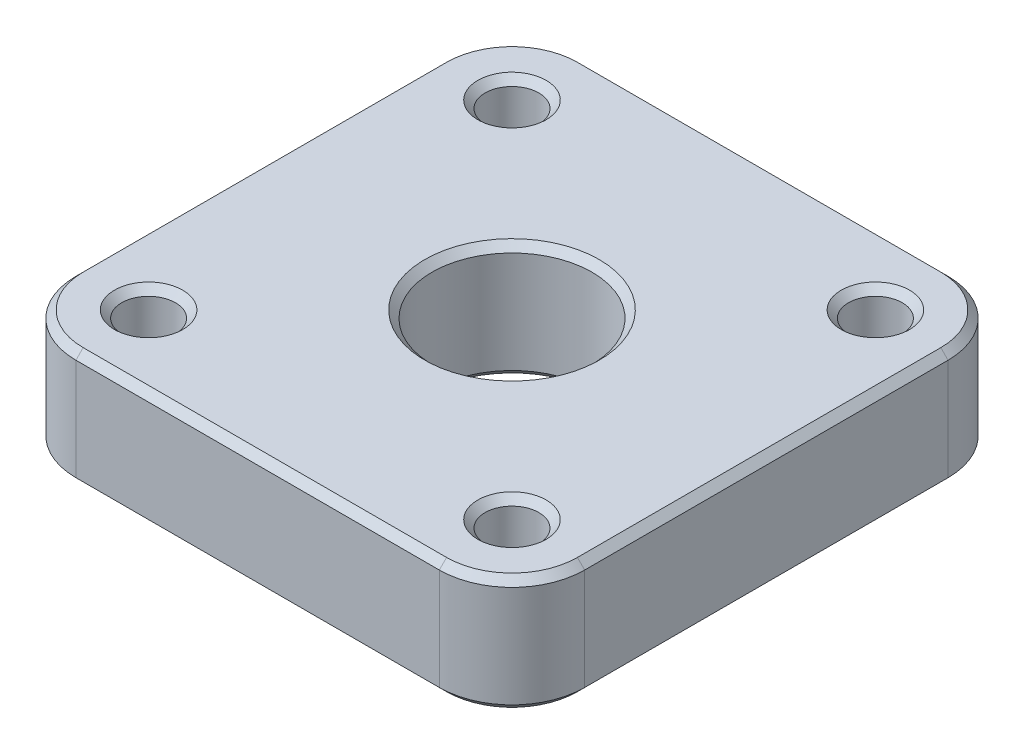
ISO-10303-21;
HEADER;
FILE_DESCRIPTION(('STEP AP214'),'2;1');
FILE_NAME('part.step','',(''),(''),'','','');
FILE_SCHEMA(('AUTOMOTIVE_DESIGN { 1 0 10303 214 1 1 1 1 }'));
ENDSEC;
DATA;
#1=APPLICATION_CONTEXT('core data for automotive mechanical design processes');
#2=APPLICATION_PROTOCOL_DEFINITION('international standard','automotive_design',2000,#1);
#3=PRODUCT_CONTEXT('',#1,'mechanical');
#4=PRODUCT('Part','Part','',(#3));
#5=PRODUCT_RELATED_PRODUCT_CATEGORY('part','',(#4));
#6=PRODUCT_DEFINITION_FORMATION('','',#4);
#7=PRODUCT_DEFINITION_CONTEXT('part definition',#1,'design');
#8=PRODUCT_DEFINITION('design','',#6,#7);
#9=PRODUCT_DEFINITION_SHAPE('','',#8);
#10=(LENGTH_UNIT() NAMED_UNIT(*) SI_UNIT(.MILLI.,.METRE.));
#11=(NAMED_UNIT(*) PLANE_ANGLE_UNIT() SI_UNIT($,.RADIAN.));
#12=(NAMED_UNIT(*) SI_UNIT($,.STERADIAN.) SOLID_ANGLE_UNIT());
#13=UNCERTAINTY_MEASURE_WITH_UNIT(LENGTH_MEASURE(1.E-05),#10,'distance_accuracy_value','');
#14=(GEOMETRIC_REPRESENTATION_CONTEXT(3) GLOBAL_UNCERTAINTY_ASSIGNED_CONTEXT((#13)) GLOBAL_UNIT_ASSIGNED_CONTEXT((#10,
#11,#12)) REPRESENTATION_CONTEXT('',''));
#15=CARTESIAN_POINT('',(0.,0.,0.));
#16=DIRECTION('',(0.,0.,1.));
#17=DIRECTION('',(1.,0.,0.));
#18=AXIS2_PLACEMENT_3D('',#15,#16,#17);
#19=CARTESIAN_POINT('',(35.,16.,35.));
#20=DIRECTION('',(-1.,0.,0.));
#21=DIRECTION('',(0.,0.,1.));
#22=AXIS2_PLACEMENT_3D('',#19,#20,#21);
#23=PLANE('',#22);
#24=DIRECTION('',(0.,-1.,0.));
#25=VECTOR('',#24,1.);
#26=CARTESIAN_POINT('',(35.,16.,25.));
#27=LINE('',#26,#25);
#28=CARTESIAN_POINT('',(35.,15.,25.));
#29=VERTEX_POINT('',#28);
#30=CARTESIAN_POINT('',(35.,1.,25.));
#31=VERTEX_POINT('',#30);
#32=EDGE_CURVE('E390',#29,#31,#27,.T.);
#33=ORIENTED_EDGE('',*,*,#32,.T.);
#34=DIRECTION('',(0.,0.,-1.));
#35=VECTOR('',#34,1.);
#36=CARTESIAN_POINT('',(35.,1.,-25.));
#37=LINE('',#36,#35);
#38=CARTESIAN_POINT('',(35.,1.,-25.));
#39=VERTEX_POINT('',#38);
#40=EDGE_CURVE('E200',#31,#39,#37,.T.);
#41=ORIENTED_EDGE('',*,*,#40,.T.);
#42=DIRECTION('',(0.,-1.,0.));
#43=VECTOR('',#42,1.);
#44=CARTESIAN_POINT('',(35.,16.,-25.));
#45=LINE('',#44,#43);
#46=CARTESIAN_POINT('',(35.,15.,-25.));
#47=VERTEX_POINT('',#46);
#48=EDGE_CURVE('E417',#39,#47,#45,.F.);
#49=ORIENTED_EDGE('',*,*,#48,.T.);
#50=DIRECTION('',(0.,0.,1.));
#51=VECTOR('',#50,1.);
#52=CARTESIAN_POINT('',(35.,15.,35.));
#53=LINE('',#52,#51);
#54=EDGE_CURVE('E197',#47,#29,#53,.T.);
#55=ORIENTED_EDGE('',*,*,#54,.T.);
#56=EDGE_LOOP('',(#33,#41,#49,#55));
#57=FACE_BOUND('',#56,.T.);
#58=ADVANCED_FACE('F41',(#57),#23,.F.);
#59=CARTESIAN_POINT('',(-35.,16.,-35.));
#60=DIRECTION('',(0.,0.,1.));
#61=DIRECTION('',(1.,0.,0.));
#62=AXIS2_PLACEMENT_3D('',#59,#60,#61);
#63=PLANE('',#62);
#64=DIRECTION('',(0.,-1.,0.));
#65=VECTOR('',#64,1.);
#66=CARTESIAN_POINT('',(25.,16.,-35.));
#67=LINE('',#66,#65);
#68=CARTESIAN_POINT('',(25.,15.,-35.));
#69=VERTEX_POINT('',#68);
#70=CARTESIAN_POINT('',(25.,1.,-35.));
#71=VERTEX_POINT('',#70);
#72=EDGE_CURVE('E409',#69,#71,#67,.T.);
#73=ORIENTED_EDGE('',*,*,#72,.T.);
#74=DIRECTION('',(-1.,0.,0.));
#75=VECTOR('',#74,1.);
#76=CARTESIAN_POINT('',(-25.,1.,-35.));
#77=LINE('',#76,#75);
#78=CARTESIAN_POINT('',(-25.,1.,-35.));
#79=VERTEX_POINT('',#78);
#80=EDGE_CURVE('E212',#71,#79,#77,.T.);
#81=ORIENTED_EDGE('',*,*,#80,.T.);
#82=DIRECTION('',(0.,-1.,0.));
#83=VECTOR('',#82,1.);
#84=CARTESIAN_POINT('',(-25.,16.,-35.));
#85=LINE('',#84,#83);
#86=CARTESIAN_POINT('',(-25.,15.,-35.));
#87=VERTEX_POINT('',#86);
#88=EDGE_CURVE('E413',#79,#87,#85,.F.);
#89=ORIENTED_EDGE('',*,*,#88,.T.);
#90=DIRECTION('',(1.,0.,0.));
#91=VECTOR('',#90,1.);
#92=CARTESIAN_POINT('',(-35.,15.,-35.));
#93=LINE('',#92,#91);
#94=EDGE_CURVE('E209',#87,#69,#93,.T.);
#95=ORIENTED_EDGE('',*,*,#94,.T.);
#96=EDGE_LOOP('',(#73,#81,#89,#95));
#97=FACE_BOUND('',#96,.T.);
#98=ADVANCED_FACE('F509',(#97),#63,.F.);
#99=CARTESIAN_POINT('',(-35.,16.,35.));
#100=DIRECTION('',(1.,0.,0.));
#101=DIRECTION('',(0.,0.,-1.));
#102=AXIS2_PLACEMENT_3D('',#99,#100,#101);
#103=PLANE('',#102);
#104=DIRECTION('',(0.,-1.,0.));
#105=VECTOR('',#104,1.);
#106=CARTESIAN_POINT('',(-35.,16.,-25.));
#107=LINE('',#106,#105);
#108=CARTESIAN_POINT('',(-35.,15.,-25.));
#109=VERTEX_POINT('',#108);
#110=CARTESIAN_POINT('',(-35.,1.,-25.));
#111=VERTEX_POINT('',#110);
#112=EDGE_CURVE('E399',#109,#111,#107,.T.);
#113=ORIENTED_EDGE('',*,*,#112,.T.);
#114=DIRECTION('',(0.,0.,1.));
#115=VECTOR('',#114,1.);
#116=CARTESIAN_POINT('',(-35.,1.,25.));
#117=LINE('',#116,#115);
#118=CARTESIAN_POINT('',(-35.,1.,25.));
#119=VERTEX_POINT('',#118);
#120=EDGE_CURVE('E225',#111,#119,#117,.T.);
#121=ORIENTED_EDGE('',*,*,#120,.T.);
#122=DIRECTION('',(0.,-1.,0.));
#123=VECTOR('',#122,1.);
#124=CARTESIAN_POINT('',(-35.,16.,25.));
#125=LINE('',#124,#123);
#126=CARTESIAN_POINT('',(-35.,15.,25.));
#127=VERTEX_POINT('',#126);
#128=EDGE_CURVE('E405',#119,#127,#125,.F.);
#129=ORIENTED_EDGE('',*,*,#128,.T.);
#130=DIRECTION('',(0.,0.,-1.));
#131=VECTOR('',#130,1.);
#132=CARTESIAN_POINT('',(-35.,15.,35.));
#133=LINE('',#132,#131);
#134=EDGE_CURVE('E222',#127,#109,#133,.T.);
#135=ORIENTED_EDGE('',*,*,#134,.T.);
#136=EDGE_LOOP('',(#113,#121,#129,#135));
#137=FACE_BOUND('',#136,.T.);
#138=ADVANCED_FACE('F493',(#137),#103,.F.);
#139=CARTESIAN_POINT('',(-35.,16.,35.));
#140=DIRECTION('',(0.,0.,-1.));
#141=DIRECTION('',(-1.,0.,0.));
#142=AXIS2_PLACEMENT_3D('',#139,#140,#141);
#143=PLANE('',#142);
#144=DIRECTION('',(0.,-1.,0.));
#145=VECTOR('',#144,1.);
#146=CARTESIAN_POINT('',(-25.,16.,35.));
#147=LINE('',#146,#145);
#148=CARTESIAN_POINT('',(-25.,15.,35.));
#149=VERTEX_POINT('',#148);
#150=CARTESIAN_POINT('',(-25.,1.,35.));
#151=VERTEX_POINT('',#150);
#152=EDGE_CURVE('E396',#149,#151,#147,.T.);
#153=ORIENTED_EDGE('',*,*,#152,.T.);
#154=DIRECTION('',(1.,0.,0.));
#155=VECTOR('',#154,1.);
#156=CARTESIAN_POINT('',(25.,1.,35.));
#157=LINE('',#156,#155);
#158=CARTESIAN_POINT('',(25.,1.,35.));
#159=VERTEX_POINT('',#158);
#160=EDGE_CURVE('E237',#151,#159,#157,.T.);
#161=ORIENTED_EDGE('',*,*,#160,.T.);
#162=DIRECTION('',(0.,-1.,0.));
#163=VECTOR('',#162,1.);
#164=CARTESIAN_POINT('',(25.,16.,35.));
#165=LINE('',#164,#163);
#166=CARTESIAN_POINT('',(25.,15.,35.));
#167=VERTEX_POINT('',#166);
#168=EDGE_CURVE('E343',#159,#167,#165,.F.);
#169=ORIENTED_EDGE('',*,*,#168,.T.);
#170=DIRECTION('',(-1.,0.,0.));
#171=VECTOR('',#170,1.);
#172=CARTESIAN_POINT('',(-35.,15.,35.));
#173=LINE('',#172,#171);
#174=EDGE_CURVE('E234',#167,#149,#173,.T.);
#175=ORIENTED_EDGE('',*,*,#174,.T.);
#176=EDGE_LOOP('',(#153,#161,#169,#175));
#177=FACE_BOUND('',#176,.T.);
#178=ADVANCED_FACE('F393',(#177),#143,.F.);
#179=CARTESIAN_POINT('',(0.,16.,0.));
#180=DIRECTION('',(0.,-1.,0.));
#181=DIRECTION('',(0.,0.,-1.));
#182=AXIS2_PLACEMENT_3D('',#179,#180,#181);
#183=PLANE('',#182);
#184=DIRECTION('',(-1.,0.,0.));
#185=VECTOR('',#184,1.);
#186=CARTESIAN_POINT('',(0.,16.,-34.));
#187=LINE('',#186,#185);
#188=CARTESIAN_POINT('',(25.,16.,-34.));
#189=VERTEX_POINT('',#188);
#190=CARTESIAN_POINT('',(-25.,16.,-34.));
#191=VERTEX_POINT('',#190);
#192=EDGE_CURVE('E52',#189,#191,#187,.T.);
#193=ORIENTED_EDGE('',*,*,#192,.T.);
#194=CARTESIAN_POINT('',(-25.,16.,-25.));
#195=DIRECTION('',(0.,-1.,0.));
#196=DIRECTION('',(0.,0.,-1.));
#197=AXIS2_PLACEMENT_3D('',#194,#195,#196);
#198=CIRCLE('',#197,9.);
#199=CARTESIAN_POINT('',(-34.,16.,-25.));
#200=VERTEX_POINT('',#199);
#201=EDGE_CURVE('E11',#191,#200,#198,.F.);
#202=ORIENTED_EDGE('',*,*,#201,.T.);
#203=DIRECTION('',(0.,0.,1.));
#204=VECTOR('',#203,1.);
#205=CARTESIAN_POINT('',(-34.,16.,0.));
#206=LINE('',#205,#204);
#207=CARTESIAN_POINT('',(-34.,16.,25.));
#208=VERTEX_POINT('',#207);
#209=EDGE_CURVE('E300',#200,#208,#206,.T.);
#210=ORIENTED_EDGE('',*,*,#209,.T.);
#211=CARTESIAN_POINT('',(-25.,16.,25.));
#212=DIRECTION('',(0.,-1.,0.));
#213=DIRECTION('',(0.,0.,-1.));
#214=AXIS2_PLACEMENT_3D('',#211,#212,#213);
#215=CIRCLE('',#214,9.);
#216=CARTESIAN_POINT('',(-25.,16.,34.));
#217=VERTEX_POINT('',#216);
#218=EDGE_CURVE('E303',#208,#217,#215,.F.);
#219=ORIENTED_EDGE('',*,*,#218,.T.);
#220=DIRECTION('',(1.,0.,0.));
#221=VECTOR('',#220,1.);
#222=CARTESIAN_POINT('',(0.,16.,34.));
#223=LINE('',#222,#221);
#224=CARTESIAN_POINT('',(25.,16.,34.));
#225=VERTEX_POINT('',#224);
#226=EDGE_CURVE('E306',#217,#225,#223,.T.);
#227=ORIENTED_EDGE('',*,*,#226,.T.);
#228=CARTESIAN_POINT('',(25.,16.,25.));
#229=DIRECTION('',(0.,-1.,0.));
#230=DIRECTION('',(0.,0.,-1.));
#231=AXIS2_PLACEMENT_3D('',#228,#229,#230);
#232=CIRCLE('',#231,9.);
#233=CARTESIAN_POINT('',(34.,16.,25.));
#234=VERTEX_POINT('',#233);
#235=EDGE_CURVE('E309',#225,#234,#232,.F.);
#236=ORIENTED_EDGE('',*,*,#235,.T.);
#237=DIRECTION('',(0.,0.,-1.));
#238=VECTOR('',#237,1.);
#239=CARTESIAN_POINT('',(34.,16.,0.));
#240=LINE('',#239,#238);
#241=CARTESIAN_POINT('',(34.,16.,-25.));
#242=VERTEX_POINT('',#241);
#243=EDGE_CURVE('E312',#234,#242,#240,.T.);
#244=ORIENTED_EDGE('',*,*,#243,.T.);
#245=CARTESIAN_POINT('',(25.,16.,-25.));
#246=DIRECTION('',(0.,-1.,0.));
#247=DIRECTION('',(0.,0.,-1.));
#248=AXIS2_PLACEMENT_3D('',#245,#246,#247);
#249=CIRCLE('',#248,9.);
#250=EDGE_CURVE('E63',#242,#189,#249,.F.);
#251=ORIENTED_EDGE('',*,*,#250,.T.);
#252=EDGE_LOOP('',(#193,#202,#210,#219,#227,#236,#244,#251));
#253=FACE_BOUND('',#252,.T.);
#254=CARTESIAN_POINT('',(0.,16.,0.));
#255=DIRECTION('',(0.,-1.,0.));
#256=DIRECTION('',(0.,0.,-1.));
#257=AXIS2_PLACEMENT_3D('',#254,#255,#256);
#258=CIRCLE('',#257,12.);
#259=CARTESIAN_POINT('',(0.,16.,-12.));
#260=VERTEX_POINT('',#259);
#261=EDGE_CURVE('E296',#260,#260,#258,.T.);
#262=ORIENTED_EDGE('',*,*,#261,.T.);
#263=EDGE_LOOP('',(#262));
#264=FACE_BOUND('',#263,.T.);
#265=CARTESIAN_POINT('',(-25.,16.,-25.));
#266=DIRECTION('',(0.,-1.,0.));
#267=DIRECTION('',(0.,0.,-1.));
#268=AXIS2_PLACEMENT_3D('',#265,#266,#267);
#269=CIRCLE('',#268,4.70000000000001);
#270=CARTESIAN_POINT('',(-25.,16.,-29.7));
#271=VERTEX_POINT('',#270);
#272=EDGE_CURVE('E292',#271,#271,#269,.T.);
#273=ORIENTED_EDGE('',*,*,#272,.T.);
#274=EDGE_LOOP('',(#273));
#275=FACE_BOUND('',#274,.T.);
#276=CARTESIAN_POINT('',(25.,16.,-25.));
#277=DIRECTION('',(0.,-1.,0.));
#278=DIRECTION('',(0.,0.,-1.));
#279=AXIS2_PLACEMENT_3D('',#276,#277,#278);
#280=CIRCLE('',#279,4.70000000000002);
#281=CARTESIAN_POINT('',(25.,16.,-29.7));
#282=VERTEX_POINT('',#281);
#283=EDGE_CURVE('E288',#282,#282,#280,.T.);
#284=ORIENTED_EDGE('',*,*,#283,.T.);
#285=EDGE_LOOP('',(#284));
#286=FACE_BOUND('',#285,.T.);
#287=CARTESIAN_POINT('',(25.,16.,25.));
#288=DIRECTION('',(0.,-1.,0.));
#289=DIRECTION('',(0.,0.,-1.));
#290=AXIS2_PLACEMENT_3D('',#287,#288,#289);
#291=CIRCLE('',#290,4.70000000000002);
#292=CARTESIAN_POINT('',(25.,16.,20.3));
#293=VERTEX_POINT('',#292);
#294=EDGE_CURVE('E284',#293,#293,#291,.T.);
#295=ORIENTED_EDGE('',*,*,#294,.T.);
#296=EDGE_LOOP('',(#295));
#297=FACE_BOUND('',#296,.T.);
#298=CARTESIAN_POINT('',(-25.,16.,25.));
#299=DIRECTION('',(0.,-1.,0.));
#300=DIRECTION('',(0.,0.,-1.));
#301=AXIS2_PLACEMENT_3D('',#298,#299,#300);
#302=CIRCLE('',#301,4.70000000000002);
#303=CARTESIAN_POINT('',(-25.,16.,20.3));
#304=VERTEX_POINT('',#303);
#305=EDGE_CURVE('E280',#304,#304,#302,.T.);
#306=ORIENTED_EDGE('',*,*,#305,.T.);
#307=EDGE_LOOP('',(#306));
#308=FACE_BOUND('',#307,.T.);
#309=ADVANCED_FACE('F480',(#253,#264,#275,#286,#297,#308),#183,.F.);
#310=CARTESIAN_POINT('',(0.,0.,0.));
#311=DIRECTION('',(0.,-1.,0.));
#312=DIRECTION('',(0.,0.,-1.));
#313=AXIS2_PLACEMENT_3D('',#310,#311,#312);
#314=PLANE('',#313);
#315=DIRECTION('',(0.,0.,1.));
#316=VECTOR('',#315,1.);
#317=CARTESIAN_POINT('',(34.,0.,25.));
#318=LINE('',#317,#316);
#319=CARTESIAN_POINT('',(34.,0.,-25.));
#320=VERTEX_POINT('',#319);
#321=CARTESIAN_POINT('',(34.,0.,25.));
#322=VERTEX_POINT('',#321);
#323=EDGE_CURVE('E183',#320,#322,#318,.T.);
#324=ORIENTED_EDGE('',*,*,#323,.T.);
#325=CARTESIAN_POINT('',(25.,0.,25.));
#326=DIRECTION('',(0.,-1.,0.));
#327=DIRECTION('',(0.,0.,-1.));
#328=AXIS2_PLACEMENT_3D('',#325,#326,#327);
#329=CIRCLE('',#328,9.);
#330=CARTESIAN_POINT('',(25.,0.,34.));
#331=VERTEX_POINT('',#330);
#332=EDGE_CURVE('E161',#322,#331,#329,.T.);
#333=ORIENTED_EDGE('',*,*,#332,.T.);
#334=DIRECTION('',(-1.,0.,0.));
#335=VECTOR('',#334,1.);
#336=CARTESIAN_POINT('',(-25.,0.,34.));
#337=LINE('',#336,#335);
#338=CARTESIAN_POINT('',(-25.,0.,34.));
#339=VERTEX_POINT('',#338);
#340=EDGE_CURVE('E170',#331,#339,#337,.T.);
#341=ORIENTED_EDGE('',*,*,#340,.T.);
#342=CARTESIAN_POINT('',(-25.,0.,25.));
#343=DIRECTION('',(0.,-1.,0.));
#344=DIRECTION('',(0.,0.,-1.));
#345=AXIS2_PLACEMENT_3D('',#342,#343,#344);
#346=CIRCLE('',#345,9.);
#347=CARTESIAN_POINT('',(-34.,0.,25.));
#348=VERTEX_POINT('',#347);
#349=EDGE_CURVE('E177',#339,#348,#346,.T.);
#350=ORIENTED_EDGE('',*,*,#349,.T.);
#351=DIRECTION('',(0.,0.,-1.));
#352=VECTOR('',#351,1.);
#353=CARTESIAN_POINT('',(-34.,0.,-25.));
#354=LINE('',#353,#352);
#355=CARTESIAN_POINT('',(-34.,0.,-25.));
#356=VERTEX_POINT('',#355);
#357=EDGE_CURVE('E444',#348,#356,#354,.T.);
#358=ORIENTED_EDGE('',*,*,#357,.T.);
#359=CARTESIAN_POINT('',(-25.,0.,-25.));
#360=DIRECTION('',(0.,-1.,0.));
#361=DIRECTION('',(0.,0.,-1.));
#362=AXIS2_PLACEMENT_3D('',#359,#360,#361);
#363=CIRCLE('',#362,9.);
#364=CARTESIAN_POINT('',(-25.,0.,-34.));
#365=VERTEX_POINT('',#364);
#366=EDGE_CURVE('E447',#356,#365,#363,.T.);
#367=ORIENTED_EDGE('',*,*,#366,.T.);
#368=DIRECTION('',(1.,0.,0.));
#369=VECTOR('',#368,1.);
#370=CARTESIAN_POINT('',(25.,0.,-34.));
#371=LINE('',#370,#369);
#372=CARTESIAN_POINT('',(25.,0.,-34.));
#373=VERTEX_POINT('',#372);
#374=EDGE_CURVE('E450',#365,#373,#371,.T.);
#375=ORIENTED_EDGE('',*,*,#374,.T.);
#376=CARTESIAN_POINT('',(25.,0.,-25.));
#377=DIRECTION('',(0.,-1.,0.));
#378=DIRECTION('',(0.,0.,-1.));
#379=AXIS2_PLACEMENT_3D('',#376,#377,#378);
#380=CIRCLE('',#379,9.);
#381=EDGE_CURVE('E191',#373,#320,#380,.T.);
#382=ORIENTED_EDGE('',*,*,#381,.T.);
#383=EDGE_LOOP('',(#324,#333,#341,#350,#358,#367,#375,#382));
#384=FACE_BOUND('',#383,.T.);
#385=CARTESIAN_POINT('',(0.,0.,0.));
#386=DIRECTION('',(0.,-1.,0.));
#387=DIRECTION('',(0.,0.,-1.));
#388=AXIS2_PLACEMENT_3D('',#385,#386,#387);
#389=CIRCLE('',#388,12.);
#390=CARTESIAN_POINT('',(0.,0.,-12.));
#391=VERTEX_POINT('',#390);
#392=EDGE_CURVE('E178',#391,#391,#389,.F.);
#393=ORIENTED_EDGE('',*,*,#392,.T.);
#394=EDGE_LOOP('',(#393));
#395=FACE_BOUND('',#394,.T.);
#396=CARTESIAN_POINT('',(-25.,0.,-25.));
#397=DIRECTION('',(0.,-1.,0.));
#398=DIRECTION('',(0.,0.,-1.));
#399=AXIS2_PLACEMENT_3D('',#396,#397,#398);
#400=CIRCLE('',#399,4.7);
#401=CARTESIAN_POINT('',(-25.,0.,-29.7));
#402=VERTEX_POINT('',#401);
#403=EDGE_CURVE('E435',#402,#402,#400,.F.);
#404=ORIENTED_EDGE('',*,*,#403,.T.);
#405=EDGE_LOOP('',(#404));
#406=FACE_BOUND('',#405,.T.);
#407=CARTESIAN_POINT('',(25.,0.,-25.));
#408=DIRECTION('',(0.,-1.,0.));
#409=DIRECTION('',(0.,0.,-1.));
#410=AXIS2_PLACEMENT_3D('',#407,#408,#409);
#411=CIRCLE('',#410,4.7);
#412=CARTESIAN_POINT('',(25.,0.,-29.7));
#413=VERTEX_POINT('',#412);
#414=EDGE_CURVE('E431',#413,#413,#411,.F.);
#415=ORIENTED_EDGE('',*,*,#414,.T.);
#416=EDGE_LOOP('',(#415));
#417=FACE_BOUND('',#416,.T.);
#418=CARTESIAN_POINT('',(25.,0.,25.));
#419=DIRECTION('',(0.,-1.,0.));
#420=DIRECTION('',(0.,0.,-1.));
#421=AXIS2_PLACEMENT_3D('',#418,#419,#420);
#422=CIRCLE('',#421,4.7);
#423=CARTESIAN_POINT('',(25.,0.,20.3));
#424=VERTEX_POINT('',#423);
#425=EDGE_CURVE('E427',#424,#424,#422,.F.);
#426=ORIENTED_EDGE('',*,*,#425,.T.);
#427=EDGE_LOOP('',(#426));
#428=FACE_BOUND('',#427,.T.);
#429=CARTESIAN_POINT('',(-25.,0.,25.));
#430=DIRECTION('',(0.,-1.,0.));
#431=DIRECTION('',(0.,0.,-1.));
#432=AXIS2_PLACEMENT_3D('',#429,#430,#431);
#433=CIRCLE('',#432,4.7);
#434=CARTESIAN_POINT('',(-25.,0.,20.3));
#435=VERTEX_POINT('',#434);
#436=EDGE_CURVE('E423',#435,#435,#433,.F.);
#437=ORIENTED_EDGE('',*,*,#436,.T.);
#438=EDGE_LOOP('',(#437));
#439=FACE_BOUND('',#438,.T.);
#440=ADVANCED_FACE('F180',(#384,#395,#406,#417,#428,#439),#314,.T.);
#441=CARTESIAN_POINT('',(0.,0.,0.));
#442=DIRECTION('',(0.,1.,0.));
#443=DIRECTION('',(0.,0.,1.));
#444=AXIS2_PLACEMENT_3D('',#441,#442,#443);
#445=CYLINDRICAL_SURFACE('',#444,11.);
#446=CARTESIAN_POINT('',(0.,1.00000000000001,0.));
#447=DIRECTION('',(0.,-1.,0.));
#448=DIRECTION('',(0.,0.,-1.));
#449=AXIS2_PLACEMENT_3D('',#446,#447,#448);
#450=CIRCLE('',#449,11.);
#451=CARTESIAN_POINT('',(0.,1.00000000000001,-11.));
#452=VERTEX_POINT('',#451);
#453=EDGE_CURVE('E244',#452,#452,#450,.T.);
#454=ORIENTED_EDGE('',*,*,#453,.T.);
#455=EDGE_LOOP('',(#454));
#456=FACE_BOUND('',#455,.T.);
#457=CARTESIAN_POINT('',(0.,15.,0.));
#458=DIRECTION('',(0.,-1.,0.));
#459=DIRECTION('',(0.,0.,-1.));
#460=AXIS2_PLACEMENT_3D('',#457,#458,#459);
#461=CIRCLE('',#460,11.);
#462=CARTESIAN_POINT('',(0.,15.,-11.));
#463=VERTEX_POINT('',#462);
#464=EDGE_CURVE('E240',#463,#463,#461,.F.);
#465=ORIENTED_EDGE('',*,*,#464,.T.);
#466=EDGE_LOOP('',(#465));
#467=FACE_BOUND('',#466,.T.);
#468=ADVANCED_FACE('F701',(#456,#467),#445,.F.);
#469=CARTESIAN_POINT('',(-25.,0.,-25.));
#470=DIRECTION('',(0.,1.,0.));
#471=DIRECTION('',(0.,0.,1.));
#472=AXIS2_PLACEMENT_3D('',#469,#470,#471);
#473=CYLINDRICAL_SURFACE('',#472,3.7);
#474=CARTESIAN_POINT('',(-25.,0.999999999999994,-25.));
#475=DIRECTION('',(0.,-1.,0.));
#476=DIRECTION('',(0.,0.,-1.));
#477=AXIS2_PLACEMENT_3D('',#474,#475,#476);
#478=CIRCLE('',#477,3.7);
#479=CARTESIAN_POINT('',(-25.,0.999999999999994,-28.7));
#480=VERTEX_POINT('',#479);
#481=EDGE_CURVE('E252',#480,#480,#478,.T.);
#482=ORIENTED_EDGE('',*,*,#481,.T.);
#483=EDGE_LOOP('',(#482));
#484=FACE_BOUND('',#483,.T.);
#485=CARTESIAN_POINT('',(-25.,15.,-25.));
#486=DIRECTION('',(0.,-1.,0.));
#487=DIRECTION('',(0.,0.,-1.));
#488=AXIS2_PLACEMENT_3D('',#485,#486,#487);
#489=CIRCLE('',#488,3.7);
#490=CARTESIAN_POINT('',(-25.,15.,-28.7));
#491=VERTEX_POINT('',#490);
#492=EDGE_CURVE('E248',#491,#491,#489,.F.);
#493=ORIENTED_EDGE('',*,*,#492,.T.);
#494=EDGE_LOOP('',(#493));
#495=FACE_BOUND('',#494,.T.);
#496=ADVANCED_FACE('F696',(#484,#495),#473,.F.);
#497=CARTESIAN_POINT('',(25.,0.,-25.));
#498=DIRECTION('',(0.,1.,0.));
#499=DIRECTION('',(0.,0.,1.));
#500=AXIS2_PLACEMENT_3D('',#497,#498,#499);
#501=CYLINDRICAL_SURFACE('',#500,3.7);
#502=CARTESIAN_POINT('',(25.,0.999999999999994,-25.));
#503=DIRECTION('',(0.,-1.,0.));
#504=DIRECTION('',(0.,0.,-1.));
#505=AXIS2_PLACEMENT_3D('',#502,#503,#504);
#506=CIRCLE('',#505,3.7);
#507=CARTESIAN_POINT('',(25.,0.999999999999994,-28.7));
#508=VERTEX_POINT('',#507);
#509=EDGE_CURVE('E260',#508,#508,#506,.T.);
#510=ORIENTED_EDGE('',*,*,#509,.T.);
#511=EDGE_LOOP('',(#510));
#512=FACE_BOUND('',#511,.T.);
#513=CARTESIAN_POINT('',(25.,15.,-25.));
#514=DIRECTION('',(0.,-1.,0.));
#515=DIRECTION('',(0.,0.,-1.));
#516=AXIS2_PLACEMENT_3D('',#513,#514,#515);
#517=CIRCLE('',#516,3.7);
#518=CARTESIAN_POINT('',(25.,15.,-28.7));
#519=VERTEX_POINT('',#518);
#520=EDGE_CURVE('E256',#519,#519,#517,.F.);
#521=ORIENTED_EDGE('',*,*,#520,.T.);
#522=EDGE_LOOP('',(#521));
#523=FACE_BOUND('',#522,.T.);
#524=ADVANCED_FACE('F687',(#512,#523),#501,.F.);
#525=CARTESIAN_POINT('',(25.,0.,25.));
#526=DIRECTION('',(0.,1.,0.));
#527=DIRECTION('',(0.,0.,1.));
#528=AXIS2_PLACEMENT_3D('',#525,#526,#527);
#529=CYLINDRICAL_SURFACE('',#528,3.7);
#530=CARTESIAN_POINT('',(25.,0.999999999999994,25.));
#531=DIRECTION('',(0.,-1.,0.));
#532=DIRECTION('',(0.,0.,-1.));
#533=AXIS2_PLACEMENT_3D('',#530,#531,#532);
#534=CIRCLE('',#533,3.7);
#535=CARTESIAN_POINT('',(25.,0.999999999999994,21.3));
#536=VERTEX_POINT('',#535);
#537=EDGE_CURVE('E268',#536,#536,#534,.T.);
#538=ORIENTED_EDGE('',*,*,#537,.T.);
#539=EDGE_LOOP('',(#538));
#540=FACE_BOUND('',#539,.T.);
#541=CARTESIAN_POINT('',(25.,15.,25.));
#542=DIRECTION('',(0.,-1.,0.));
#543=DIRECTION('',(0.,0.,-1.));
#544=AXIS2_PLACEMENT_3D('',#541,#542,#543);
#545=CIRCLE('',#544,3.7);
#546=CARTESIAN_POINT('',(25.,15.,21.3));
#547=VERTEX_POINT('',#546);
#548=EDGE_CURVE('E264',#547,#547,#545,.F.);
#549=ORIENTED_EDGE('',*,*,#548,.T.);
#550=EDGE_LOOP('',(#549));
#551=FACE_BOUND('',#550,.T.);
#552=ADVANCED_FACE('F685',(#540,#551),#529,.F.);
#553=CARTESIAN_POINT('',(-25.,0.,25.));
#554=DIRECTION('',(0.,1.,0.));
#555=DIRECTION('',(0.,0.,1.));
#556=AXIS2_PLACEMENT_3D('',#553,#554,#555);
#557=CYLINDRICAL_SURFACE('',#556,3.7);
#558=CARTESIAN_POINT('',(-25.,0.999999999999994,25.));
#559=DIRECTION('',(0.,-1.,0.));
#560=DIRECTION('',(0.,0.,-1.));
#561=AXIS2_PLACEMENT_3D('',#558,#559,#560);
#562=CIRCLE('',#561,3.7);
#563=CARTESIAN_POINT('',(-25.,0.999999999999994,21.3));
#564=VERTEX_POINT('',#563);
#565=EDGE_CURVE('E276',#564,#564,#562,.T.);
#566=ORIENTED_EDGE('',*,*,#565,.T.);
#567=EDGE_LOOP('',(#566));
#568=FACE_BOUND('',#567,.T.);
#569=CARTESIAN_POINT('',(-25.,15.,25.));
#570=DIRECTION('',(0.,-1.,0.));
#571=DIRECTION('',(0.,0.,-1.));
#572=AXIS2_PLACEMENT_3D('',#569,#570,#571);
#573=CIRCLE('',#572,3.7);
#574=CARTESIAN_POINT('',(-25.,15.,21.3));
#575=VERTEX_POINT('',#574);
#576=EDGE_CURVE('E272',#575,#575,#573,.F.);
#577=ORIENTED_EDGE('',*,*,#576,.T.);
#578=EDGE_LOOP('',(#577));
#579=FACE_BOUND('',#578,.T.);
#580=ADVANCED_FACE('F523',(#568,#579),#557,.F.);
#581=CARTESIAN_POINT('',(-25.,16.,25.));
#582=DIRECTION('',(0.,-1.,0.));
#583=DIRECTION('',(0.,0.,-1.));
#584=AXIS2_PLACEMENT_3D('',#581,#582,#583);
#585=CYLINDRICAL_SURFACE('',#584,10.);
#586=ORIENTED_EDGE('',*,*,#128,.F.);
#587=CARTESIAN_POINT('',(-25.,1.,25.));
#588=DIRECTION('',(0.,-1.,0.));
#589=DIRECTION('',(0.,0.,-1.));
#590=AXIS2_PLACEMENT_3D('',#587,#588,#589);
#591=CIRCLE('',#590,10.);
#592=EDGE_CURVE('E231',#119,#151,#591,.F.);
#593=ORIENTED_EDGE('',*,*,#592,.T.);
#594=ORIENTED_EDGE('',*,*,#152,.F.);
#595=CARTESIAN_POINT('',(-25.,15.,25.));
#596=DIRECTION('',(0.,-1.,0.));
#597=DIRECTION('',(0.,0.,-1.));
#598=AXIS2_PLACEMENT_3D('',#595,#596,#597);
#599=CIRCLE('',#598,10.);
#600=EDGE_CURVE('E228',#149,#127,#599,.T.);
#601=ORIENTED_EDGE('',*,*,#600,.T.);
#602=EDGE_LOOP('',(#586,#593,#594,#601));
#603=FACE_BOUND('',#602,.T.);
#604=ADVANCED_FACE('F520',(#603),#585,.T.);
#605=CARTESIAN_POINT('',(-25.,16.,-25.));
#606=DIRECTION('',(0.,-1.,0.));
#607=DIRECTION('',(0.,0.,-1.));
#608=AXIS2_PLACEMENT_3D('',#605,#606,#607);
#609=CYLINDRICAL_SURFACE('',#608,10.);
#610=ORIENTED_EDGE('',*,*,#88,.F.);
#611=CARTESIAN_POINT('',(-25.,1.,-25.));
#612=DIRECTION('',(0.,-1.,0.));
#613=DIRECTION('',(0.,0.,-1.));
#614=AXIS2_PLACEMENT_3D('',#611,#612,#613);
#615=CIRCLE('',#614,10.);
#616=EDGE_CURVE('E219',#79,#111,#615,.F.);
#617=ORIENTED_EDGE('',*,*,#616,.T.);
#618=ORIENTED_EDGE('',*,*,#112,.F.);
#619=CARTESIAN_POINT('',(-25.,15.,-25.));
#620=DIRECTION('',(0.,-1.,0.));
#621=DIRECTION('',(0.,0.,-1.));
#622=AXIS2_PLACEMENT_3D('',#619,#620,#621);
#623=CIRCLE('',#622,10.);
#624=EDGE_CURVE('E215',#109,#87,#623,.T.);
#625=ORIENTED_EDGE('',*,*,#624,.T.);
#626=EDGE_LOOP('',(#610,#617,#618,#625));
#627=FACE_BOUND('',#626,.T.);
#628=ADVANCED_FACE('F498',(#627),#609,.T.);
#629=CARTESIAN_POINT('',(25.,16.,25.));
#630=DIRECTION('',(0.,-1.,0.));
#631=DIRECTION('',(0.,0.,-1.));
#632=AXIS2_PLACEMENT_3D('',#629,#630,#631);
#633=CYLINDRICAL_SURFACE('',#632,10.);
#634=ORIENTED_EDGE('',*,*,#168,.F.);
#635=CARTESIAN_POINT('',(25.,1.,25.));
#636=DIRECTION('',(0.,-1.,0.));
#637=DIRECTION('',(0.,0.,-1.));
#638=AXIS2_PLACEMENT_3D('',#635,#636,#637);
#639=CIRCLE('',#638,10.);
#640=EDGE_CURVE('E163',#159,#31,#639,.F.);
#641=ORIENTED_EDGE('',*,*,#640,.T.);
#642=ORIENTED_EDGE('',*,*,#32,.F.);
#643=CARTESIAN_POINT('',(25.,15.,25.));
#644=DIRECTION('',(0.,-1.,0.));
#645=DIRECTION('',(0.,0.,-1.));
#646=AXIS2_PLACEMENT_3D('',#643,#644,#645);
#647=CIRCLE('',#646,10.);
#648=EDGE_CURVE('E186',#29,#167,#647,.T.);
#649=ORIENTED_EDGE('',*,*,#648,.T.);
#650=EDGE_LOOP('',(#634,#641,#642,#649));
#651=FACE_BOUND('',#650,.T.);
#652=ADVANCED_FACE('F388',(#651),#633,.T.);
#653=CARTESIAN_POINT('',(25.,16.,-25.));
#654=DIRECTION('',(0.,-1.,0.));
#655=DIRECTION('',(0.,0.,-1.));
#656=AXIS2_PLACEMENT_3D('',#653,#654,#655);
#657=CYLINDRICAL_SURFACE('',#656,10.);
#658=ORIENTED_EDGE('',*,*,#48,.F.);
#659=CARTESIAN_POINT('',(25.,1.,-25.));
#660=DIRECTION('',(0.,-1.,0.));
#661=DIRECTION('',(0.,0.,-1.));
#662=AXIS2_PLACEMENT_3D('',#659,#660,#661);
#663=CIRCLE('',#662,10.);
#664=EDGE_CURVE('E206',#39,#71,#663,.F.);
#665=ORIENTED_EDGE('',*,*,#664,.T.);
#666=ORIENTED_EDGE('',*,*,#72,.F.);
#667=CARTESIAN_POINT('',(25.,15.,-25.));
#668=DIRECTION('',(0.,-1.,0.));
#669=DIRECTION('',(0.,0.,-1.));
#670=AXIS2_PLACEMENT_3D('',#667,#668,#669);
#671=CIRCLE('',#670,10.);
#672=EDGE_CURVE('E203',#69,#47,#671,.T.);
#673=ORIENTED_EDGE('',*,*,#672,.T.);
#674=EDGE_LOOP('',(#658,#665,#666,#673));
#675=FACE_BOUND('',#674,.T.);
#676=ADVANCED_FACE('F466',(#675),#657,.T.);
#677=CARTESIAN_POINT('',(-25.,0.,-25.));
#678=DIRECTION('',(0.,1.,0.));
#679=DIRECTION('',(0.,0.,1.));
#680=AXIS2_PLACEMENT_3D('',#677,#678,#679);
#681=CONICAL_SURFACE('',#680,9.,0.785398163397447);
#682=DIRECTION('',(0.707106781186547,-0.707106781186547,0.));
#683=VECTOR('',#682,1.);
#684=CARTESIAN_POINT('',(-35.,1.,-25.));
#685=LINE('',#684,#683);
#686=EDGE_CURVE('E335',#111,#356,#685,.T.);
#687=ORIENTED_EDGE('',*,*,#686,.F.);
#688=ORIENTED_EDGE('',*,*,#616,.F.);
#689=DIRECTION('',(0.,0.707106781186547,-0.707106781186547));
#690=VECTOR('',#689,1.);
#691=CARTESIAN_POINT('',(-25.,0.,-34.));
#692=LINE('',#691,#690);
#693=EDGE_CURVE('E339',#365,#79,#692,.T.);
#694=ORIENTED_EDGE('',*,*,#693,.F.);
#695=ORIENTED_EDGE('',*,*,#366,.F.);
#696=EDGE_LOOP('',(#687,#688,#694,#695));
#697=FACE_BOUND('',#696,.T.);
#698=ADVANCED_FACE('F502',(#697),#681,.T.);
#699=CARTESIAN_POINT('',(-35.,1.,-35.));
#700=DIRECTION('',(0.,-0.707106781186546,-0.707106781186549));
#701=DIRECTION('',(1.,0.,0.));
#702=AXIS2_PLACEMENT_3D('',#699,#700,#701);
#703=PLANE('',#702);
#704=ORIENTED_EDGE('',*,*,#693,.T.);
#705=ORIENTED_EDGE('',*,*,#80,.F.);
#706=DIRECTION('',(0.,0.70710678118655,-0.707106781186545));
#707=VECTOR('',#706,1.);
#708=CARTESIAN_POINT('',(25.,0.,-34.));
#709=LINE('',#708,#707);
#710=EDGE_CURVE('E331',#373,#71,#709,.T.);
#711=ORIENTED_EDGE('',*,*,#710,.F.);
#712=ORIENTED_EDGE('',*,*,#374,.F.);
#713=EDGE_LOOP('',(#704,#705,#711,#712));
#714=FACE_BOUND('',#713,.T.);
#715=ADVANCED_FACE('F507',(#714),#703,.T.);
#716=CARTESIAN_POINT('',(-35.,1.,35.));
#717=DIRECTION('',(-0.707106781186547,-0.707106781186547,0.));
#718=DIRECTION('',(0.,0.,-1.));
#719=AXIS2_PLACEMENT_3D('',#716,#717,#718);
#720=PLANE('',#719);
#721=ORIENTED_EDGE('',*,*,#686,.T.);
#722=ORIENTED_EDGE('',*,*,#357,.F.);
#723=DIRECTION('',(0.707106781186547,-0.707106781186547,0.));
#724=VECTOR('',#723,1.);
#725=CARTESIAN_POINT('',(-35.,1.,25.));
#726=LINE('',#725,#724);
#727=EDGE_CURVE('E327',#119,#348,#726,.T.);
#728=ORIENTED_EDGE('',*,*,#727,.F.);
#729=ORIENTED_EDGE('',*,*,#120,.F.);
#730=EDGE_LOOP('',(#721,#722,#728,#729));
#731=FACE_BOUND('',#730,.T.);
#732=ADVANCED_FACE('F561',(#731),#720,.T.);
#733=CARTESIAN_POINT('',(25.,0.,-25.));
#734=DIRECTION('',(0.,1.,0.));
#735=DIRECTION('',(0.,0.,1.));
#736=AXIS2_PLACEMENT_3D('',#733,#734,#735);
#737=CONICAL_SURFACE('',#736,9.,0.785398163397447);
#738=ORIENTED_EDGE('',*,*,#710,.T.);
#739=ORIENTED_EDGE('',*,*,#664,.F.);
#740=DIRECTION('',(0.707106781186547,0.707106781186547,0.));
#741=VECTOR('',#740,1.);
#742=CARTESIAN_POINT('',(34.,0.,-25.));
#743=LINE('',#742,#741);
#744=EDGE_CURVE('E323',#320,#39,#743,.T.);
#745=ORIENTED_EDGE('',*,*,#744,.F.);
#746=ORIENTED_EDGE('',*,*,#381,.F.);
#747=EDGE_LOOP('',(#738,#739,#745,#746));
#748=FACE_BOUND('',#747,.T.);
#749=ADVANCED_FACE('F459',(#748),#737,.T.);
#750=CARTESIAN_POINT('',(-25.,0.,25.));
#751=DIRECTION('',(0.,1.,0.));
#752=DIRECTION('',(0.,0.,1.));
#753=AXIS2_PLACEMENT_3D('',#750,#751,#752);
#754=CONICAL_SURFACE('',#753,9.,0.785398163397447);
#755=ORIENTED_EDGE('',*,*,#727,.T.);
#756=ORIENTED_EDGE('',*,*,#349,.F.);
#757=DIRECTION('',(0.,-0.707106781186547,-0.707106781186547));
#758=VECTOR('',#757,1.);
#759=CARTESIAN_POINT('',(-25.,1.,35.));
#760=LINE('',#759,#758);
#761=EDGE_CURVE('E173',#151,#339,#760,.T.);
#762=ORIENTED_EDGE('',*,*,#761,.F.);
#763=ORIENTED_EDGE('',*,*,#592,.F.);
#764=EDGE_LOOP('',(#755,#756,#762,#763));
#765=FACE_BOUND('',#764,.T.);
#766=ADVANCED_FACE('F549',(#765),#754,.T.);
#767=CARTESIAN_POINT('',(35.,1.,35.));
#768=DIRECTION('',(0.707106781186549,-0.707106781186546,0.));
#769=DIRECTION('',(0.,0.,1.));
#770=AXIS2_PLACEMENT_3D('',#767,#768,#769);
#771=PLANE('',#770);
#772=ORIENTED_EDGE('',*,*,#744,.T.);
#773=ORIENTED_EDGE('',*,*,#40,.F.);
#774=DIRECTION('',(0.707106781186545,0.70710678118655,0.));
#775=VECTOR('',#774,1.);
#776=CARTESIAN_POINT('',(34.,0.,25.));
#777=LINE('',#776,#775);
#778=EDGE_CURVE('E167',#322,#31,#777,.T.);
#779=ORIENTED_EDGE('',*,*,#778,.F.);
#780=ORIENTED_EDGE('',*,*,#323,.F.);
#781=EDGE_LOOP('',(#772,#773,#779,#780));
#782=FACE_BOUND('',#781,.T.);
#783=ADVANCED_FACE('F462',(#782),#771,.T.);
#784=CARTESIAN_POINT('',(-35.,1.,35.));
#785=DIRECTION('',(0.,-0.707106781186547,0.707106781186547));
#786=DIRECTION('',(-1.,0.,0.));
#787=AXIS2_PLACEMENT_3D('',#784,#785,#786);
#788=PLANE('',#787);
#789=ORIENTED_EDGE('',*,*,#761,.T.);
#790=ORIENTED_EDGE('',*,*,#340,.F.);
#791=DIRECTION('',(0.,-0.707106781186547,-0.707106781186547));
#792=VECTOR('',#791,1.);
#793=CARTESIAN_POINT('',(25.,1.,35.));
#794=LINE('',#793,#792);
#795=EDGE_CURVE('E157',#159,#331,#794,.T.);
#796=ORIENTED_EDGE('',*,*,#795,.F.);
#797=ORIENTED_EDGE('',*,*,#160,.F.);
#798=EDGE_LOOP('',(#789,#790,#796,#797));
#799=FACE_BOUND('',#798,.T.);
#800=ADVANCED_FACE('F171',(#799),#788,.T.);
#801=CARTESIAN_POINT('',(25.,0.,25.));
#802=DIRECTION('',(0.,1.,0.));
#803=DIRECTION('',(0.,0.,1.));
#804=AXIS2_PLACEMENT_3D('',#801,#802,#803);
#805=CONICAL_SURFACE('',#804,9.,0.785398163397447);
#806=ORIENTED_EDGE('',*,*,#778,.T.);
#807=ORIENTED_EDGE('',*,*,#640,.F.);
#808=ORIENTED_EDGE('',*,*,#795,.T.);
#809=ORIENTED_EDGE('',*,*,#332,.F.);
#810=EDGE_LOOP('',(#806,#807,#808,#809));
#811=FACE_BOUND('',#810,.T.);
#812=ADVANCED_FACE('F159',(#811),#805,.T.);
#813=CARTESIAN_POINT('',(0.,0.,0.));
#814=DIRECTION('',(0.,-1.,0.));
#815=DIRECTION('',(0.,0.,-1.));
#816=AXIS2_PLACEMENT_3D('',#813,#814,#815);
#817=CONICAL_SURFACE('',#816,12.,0.785398163397447);
#818=ORIENTED_EDGE('',*,*,#453,.F.);
#819=EDGE_LOOP('',(#818));
#820=FACE_BOUND('',#819,.T.);
#821=ORIENTED_EDGE('',*,*,#392,.F.);
#822=EDGE_LOOP('',(#821));
#823=FACE_BOUND('',#822,.T.);
#824=ADVANCED_FACE('F538',(#820,#823),#817,.F.);
#825=CARTESIAN_POINT('',(-25.,0.,-25.));
#826=DIRECTION('',(0.,-1.,0.));
#827=DIRECTION('',(0.,0.,-1.));
#828=AXIS2_PLACEMENT_3D('',#825,#826,#827);
#829=CONICAL_SURFACE('',#828,4.7,0.785398163397448);
#830=ORIENTED_EDGE('',*,*,#481,.F.);
#831=EDGE_LOOP('',(#830));
#832=FACE_BOUND('',#831,.T.);
#833=ORIENTED_EDGE('',*,*,#403,.F.);
#834=EDGE_LOOP('',(#833));
#835=FACE_BOUND('',#834,.T.);
#836=ADVANCED_FACE('F582',(#832,#835),#829,.F.);
#837=CARTESIAN_POINT('',(25.,0.,-25.));
#838=DIRECTION('',(0.,-1.,0.));
#839=DIRECTION('',(0.,0.,-1.));
#840=AXIS2_PLACEMENT_3D('',#837,#838,#839);
#841=CONICAL_SURFACE('',#840,4.7,0.785398163397448);
#842=ORIENTED_EDGE('',*,*,#509,.F.);
#843=EDGE_LOOP('',(#842));
#844=FACE_BOUND('',#843,.T.);
#845=ORIENTED_EDGE('',*,*,#414,.F.);
#846=EDGE_LOOP('',(#845));
#847=FACE_BOUND('',#846,.T.);
#848=ADVANCED_FACE('F589',(#844,#847),#841,.F.);
#849=CARTESIAN_POINT('',(25.,0.,25.));
#850=DIRECTION('',(0.,-1.,0.));
#851=DIRECTION('',(0.,0.,-1.));
#852=AXIS2_PLACEMENT_3D('',#849,#850,#851);
#853=CONICAL_SURFACE('',#852,4.7,0.785398163397448);
#854=ORIENTED_EDGE('',*,*,#537,.F.);
#855=EDGE_LOOP('',(#854));
#856=FACE_BOUND('',#855,.T.);
#857=ORIENTED_EDGE('',*,*,#425,.F.);
#858=EDGE_LOOP('',(#857));
#859=FACE_BOUND('',#858,.T.);
#860=ADVANCED_FACE('F596',(#856,#859),#853,.F.);
#861=CARTESIAN_POINT('',(-25.,0.,25.));
#862=DIRECTION('',(0.,-1.,0.));
#863=DIRECTION('',(0.,0.,-1.));
#864=AXIS2_PLACEMENT_3D('',#861,#862,#863);
#865=CONICAL_SURFACE('',#864,4.7,0.785398163397448);
#866=ORIENTED_EDGE('',*,*,#565,.F.);
#867=EDGE_LOOP('',(#866));
#868=FACE_BOUND('',#867,.T.);
#869=ORIENTED_EDGE('',*,*,#436,.F.);
#870=EDGE_LOOP('',(#869));
#871=FACE_BOUND('',#870,.T.);
#872=ADVANCED_FACE('F603',(#868,#871),#865,.F.);
#873=CARTESIAN_POINT('',(25.,16.,25.));
#874=DIRECTION('',(0.,-1.,0.));
#875=DIRECTION('',(0.,0.,-1.));
#876=AXIS2_PLACEMENT_3D('',#873,#874,#875);
#877=CONICAL_SURFACE('',#876,9.,0.785398163397447);
#878=DIRECTION('',(0.,0.707106781186547,-0.707106781186547));
#879=VECTOR('',#878,1.);
#880=CARTESIAN_POINT('',(25.,15.,35.));
#881=LINE('',#880,#879);
#882=EDGE_CURVE('E365',#167,#225,#881,.T.);
#883=ORIENTED_EDGE('',*,*,#882,.F.);
#884=ORIENTED_EDGE('',*,*,#648,.F.);
#885=DIRECTION('',(0.707106781186547,-0.707106781186547,0.));
#886=VECTOR('',#885,1.);
#887=CARTESIAN_POINT('',(34.,16.,25.));
#888=LINE('',#887,#886);
#889=EDGE_CURVE('E46',#234,#29,#888,.T.);
#890=ORIENTED_EDGE('',*,*,#889,.F.);
#891=ORIENTED_EDGE('',*,*,#235,.F.);
#892=EDGE_LOOP('',(#883,#884,#890,#891));
#893=FACE_BOUND('',#892,.T.);
#894=ADVANCED_FACE('F383',(#893),#877,.T.);
#895=CARTESIAN_POINT('',(34.,16.,0.));
#896=DIRECTION('',(-0.707106781186549,-0.707106781186546,0.));
#897=DIRECTION('',(0.,0.,-1.));
#898=AXIS2_PLACEMENT_3D('',#895,#896,#897);
#899=PLANE('',#898);
#900=ORIENTED_EDGE('',*,*,#889,.T.);
#901=ORIENTED_EDGE('',*,*,#54,.F.);
#902=DIRECTION('',(0.707106781186547,-0.707106781186547,0.));
#903=VECTOR('',#902,1.);
#904=CARTESIAN_POINT('',(34.,16.,-25.));
#905=LINE('',#904,#903);
#906=EDGE_CURVE('E362',#242,#47,#905,.T.);
#907=ORIENTED_EDGE('',*,*,#906,.F.);
#908=ORIENTED_EDGE('',*,*,#243,.F.);
#909=EDGE_LOOP('',(#900,#901,#907,#908));
#910=FACE_BOUND('',#909,.T.);
#911=ADVANCED_FACE('F378',(#910),#899,.F.);
#912=CARTESIAN_POINT('',(0.,16.,34.));
#913=DIRECTION('',(0.,-0.707106781186547,-0.707106781186547));
#914=DIRECTION('',(1.,0.,0.));
#915=AXIS2_PLACEMENT_3D('',#912,#913,#914);
#916=PLANE('',#915);
#917=ORIENTED_EDGE('',*,*,#882,.T.);
#918=ORIENTED_EDGE('',*,*,#226,.F.);
#919=DIRECTION('',(0.,0.707106781186547,-0.707106781186547));
#920=VECTOR('',#919,1.);
#921=CARTESIAN_POINT('',(-25.,15.,35.));
#922=LINE('',#921,#920);
#923=EDGE_CURVE('E358',#149,#217,#922,.T.);
#924=ORIENTED_EDGE('',*,*,#923,.F.);
#925=ORIENTED_EDGE('',*,*,#174,.F.);
#926=EDGE_LOOP('',(#917,#918,#924,#925));
#927=FACE_BOUND('',#926,.T.);
#928=ADVANCED_FACE('F639',(#927),#916,.F.);
#929=CARTESIAN_POINT('',(25.,16.,-25.));
#930=DIRECTION('',(0.,-1.,0.));
#931=DIRECTION('',(0.,0.,-1.));
#932=AXIS2_PLACEMENT_3D('',#929,#930,#931);
#933=CONICAL_SURFACE('',#932,9.,0.785398163397447);
#934=ORIENTED_EDGE('',*,*,#906,.T.);
#935=ORIENTED_EDGE('',*,*,#672,.F.);
#936=DIRECTION('',(0.,-0.707106781186547,-0.707106781186547));
#937=VECTOR('',#936,1.);
#938=CARTESIAN_POINT('',(25.,16.,-34.));
#939=LINE('',#938,#937);
#940=EDGE_CURVE('E354',#189,#69,#939,.T.);
#941=ORIENTED_EDGE('',*,*,#940,.F.);
#942=ORIENTED_EDGE('',*,*,#250,.F.);
#943=EDGE_LOOP('',(#934,#935,#941,#942));
#944=FACE_BOUND('',#943,.T.);
#945=ADVANCED_FACE('F470',(#944),#933,.T.);
#946=CARTESIAN_POINT('',(-25.,16.,25.));
#947=DIRECTION('',(0.,-1.,0.));
#948=DIRECTION('',(0.,0.,-1.));
#949=AXIS2_PLACEMENT_3D('',#946,#947,#948);
#950=CONICAL_SURFACE('',#949,9.,0.785398163397447);
#951=ORIENTED_EDGE('',*,*,#923,.T.);
#952=ORIENTED_EDGE('',*,*,#218,.F.);
#953=DIRECTION('',(0.707106781186547,0.707106781186547,0.));
#954=VECTOR('',#953,1.);
#955=CARTESIAN_POINT('',(-35.,15.,25.));
#956=LINE('',#955,#954);
#957=EDGE_CURVE('E350',#127,#208,#956,.T.);
#958=ORIENTED_EDGE('',*,*,#957,.F.);
#959=ORIENTED_EDGE('',*,*,#600,.F.);
#960=EDGE_LOOP('',(#951,#952,#958,#959));
#961=FACE_BOUND('',#960,.T.);
#962=ADVANCED_FACE('F486',(#961),#950,.T.);
#963=CARTESIAN_POINT('',(0.,16.,-34.));
#964=DIRECTION('',(0.,-0.707106781186546,0.707106781186549));
#965=DIRECTION('',(-1.,0.,0.));
#966=AXIS2_PLACEMENT_3D('',#963,#964,#965);
#967=PLANE('',#966);
#968=ORIENTED_EDGE('',*,*,#940,.T.);
#969=ORIENTED_EDGE('',*,*,#94,.F.);
#970=DIRECTION('',(0.,-0.707106781186547,-0.707106781186547));
#971=VECTOR('',#970,1.);
#972=CARTESIAN_POINT('',(-25.,16.,-34.));
#973=LINE('',#972,#971);
#974=EDGE_CURVE('E347',#191,#87,#973,.T.);
#975=ORIENTED_EDGE('',*,*,#974,.F.);
#976=ORIENTED_EDGE('',*,*,#192,.F.);
#977=EDGE_LOOP('',(#968,#969,#975,#976));
#978=FACE_BOUND('',#977,.T.);
#979=ADVANCED_FACE('F473',(#978),#967,.F.);
#980=CARTESIAN_POINT('',(-34.,16.,0.));
#981=DIRECTION('',(0.707106781186547,-0.707106781186547,0.));
#982=DIRECTION('',(0.,0.,1.));
#983=AXIS2_PLACEMENT_3D('',#980,#981,#982);
#984=PLANE('',#983);
#985=ORIENTED_EDGE('',*,*,#957,.T.);
#986=ORIENTED_EDGE('',*,*,#209,.F.);
#987=DIRECTION('',(0.707106781186547,0.707106781186547,0.));
#988=VECTOR('',#987,1.);
#989=CARTESIAN_POINT('',(-35.,15.,-25.));
#990=LINE('',#989,#988);
#991=EDGE_CURVE('E344',#109,#200,#990,.T.);
#992=ORIENTED_EDGE('',*,*,#991,.F.);
#993=ORIENTED_EDGE('',*,*,#134,.F.);
#994=EDGE_LOOP('',(#985,#986,#992,#993));
#995=FACE_BOUND('',#994,.T.);
#996=ADVANCED_FACE('F490',(#995),#984,.F.);
#997=CARTESIAN_POINT('',(-25.,16.,-25.));
#998=DIRECTION('',(0.,-1.,0.));
#999=DIRECTION('',(0.,0.,-1.));
#1000=AXIS2_PLACEMENT_3D('',#997,#998,#999);
#1001=CONICAL_SURFACE('',#1000,9.,0.785398163397447);
#1002=ORIENTED_EDGE('',*,*,#974,.T.);
#1003=ORIENTED_EDGE('',*,*,#624,.F.);
#1004=ORIENTED_EDGE('',*,*,#991,.T.);
#1005=ORIENTED_EDGE('',*,*,#201,.F.);
#1006=EDGE_LOOP('',(#1002,#1003,#1004,#1005));
#1007=FACE_BOUND('',#1006,.T.);
#1008=ADVANCED_FACE('F477',(#1007),#1001,.T.);
#1009=CARTESIAN_POINT('',(0.,15.,0.));
#1010=DIRECTION('',(0.,1.,0.));
#1011=DIRECTION('',(0.,0.,1.));
#1012=AXIS2_PLACEMENT_3D('',#1009,#1010,#1011);
#1013=CONICAL_SURFACE('',#1012,11.,0.785398163397443);
#1014=ORIENTED_EDGE('',*,*,#261,.F.);
#1015=EDGE_LOOP('',(#1014));
#1016=FACE_BOUND('',#1015,.T.);
#1017=ORIENTED_EDGE('',*,*,#464,.F.);
#1018=EDGE_LOOP('',(#1017));
#1019=FACE_BOUND('',#1018,.T.);
#1020=ADVANCED_FACE('F618',(#1016,#1019),#1013,.F.);
#1021=CARTESIAN_POINT('',(-25.,15.,-25.));
#1022=DIRECTION('',(0.,1.,0.));
#1023=DIRECTION('',(0.,0.,1.));
#1024=AXIS2_PLACEMENT_3D('',#1021,#1022,#1023);
#1025=CONICAL_SURFACE('',#1024,3.7,0.785398163397449);
#1026=ORIENTED_EDGE('',*,*,#272,.F.);
#1027=EDGE_LOOP('',(#1026));
#1028=FACE_BOUND('',#1027,.T.);
#1029=ORIENTED_EDGE('',*,*,#492,.F.);
#1030=EDGE_LOOP('',(#1029));
#1031=FACE_BOUND('',#1030,.T.);
#1032=ADVANCED_FACE('F658',(#1028,#1031),#1025,.F.);
#1033=CARTESIAN_POINT('',(25.,15.,-25.));
#1034=DIRECTION('',(0.,1.,0.));
#1035=DIRECTION('',(0.,0.,1.));
#1036=AXIS2_PLACEMENT_3D('',#1033,#1034,#1035);
#1037=CONICAL_SURFACE('',#1036,3.7,0.785398163397449);
#1038=ORIENTED_EDGE('',*,*,#283,.F.);
#1039=EDGE_LOOP('',(#1038));
#1040=FACE_BOUND('',#1039,.T.);
#1041=ORIENTED_EDGE('',*,*,#520,.F.);
#1042=EDGE_LOOP('',(#1041));
#1043=FACE_BOUND('',#1042,.T.);
#1044=ADVANCED_FACE('F665',(#1040,#1043),#1037,.F.);
#1045=CARTESIAN_POINT('',(25.,15.,25.));
#1046=DIRECTION('',(0.,1.,0.));
#1047=DIRECTION('',(0.,0.,1.));
#1048=AXIS2_PLACEMENT_3D('',#1045,#1046,#1047);
#1049=CONICAL_SURFACE('',#1048,3.7,0.785398163397449);
#1050=ORIENTED_EDGE('',*,*,#294,.F.);
#1051=EDGE_LOOP('',(#1050));
#1052=FACE_BOUND('',#1051,.T.);
#1053=ORIENTED_EDGE('',*,*,#548,.F.);
#1054=EDGE_LOOP('',(#1053));
#1055=FACE_BOUND('',#1054,.T.);
#1056=ADVANCED_FACE('F671',(#1052,#1055),#1049,.F.);
#1057=CARTESIAN_POINT('',(-25.,15.,25.));
#1058=DIRECTION('',(0.,1.,0.));
#1059=DIRECTION('',(0.,0.,1.));
#1060=AXIS2_PLACEMENT_3D('',#1057,#1058,#1059);
#1061=CONICAL_SURFACE('',#1060,3.7,0.785398163397449);
#1062=ORIENTED_EDGE('',*,*,#305,.F.);
#1063=EDGE_LOOP('',(#1062));
#1064=FACE_BOUND('',#1063,.T.);
#1065=ORIENTED_EDGE('',*,*,#576,.F.);
#1066=EDGE_LOOP('',(#1065));
#1067=FACE_BOUND('',#1066,.T.);
#1068=ADVANCED_FACE('F44',(#1064,#1067),#1061,.F.);
#1069=CLOSED_SHELL('',(#58,#98,#138,#178,#309,#440,#468,#496,#524,#552,#580,#604,#628,#652,#676,
#698,#715,#732,#749,#766,#783,#800,#812,#824,#836,#848,#860,#872,#894,#911,#928,#945,#962,#979,
#996,#1008,#1020,#1032,#1044,#1056,#1068));
#1070=MANIFOLD_SOLID_BREP('B2',#1069);
#1071=ADVANCED_BREP_SHAPE_REPRESENTATION('',(#18,#1070),#14);
#1072=SHAPE_DEFINITION_REPRESENTATION(#9,#1071);
ENDSEC;
END-ISO-10303-21;
